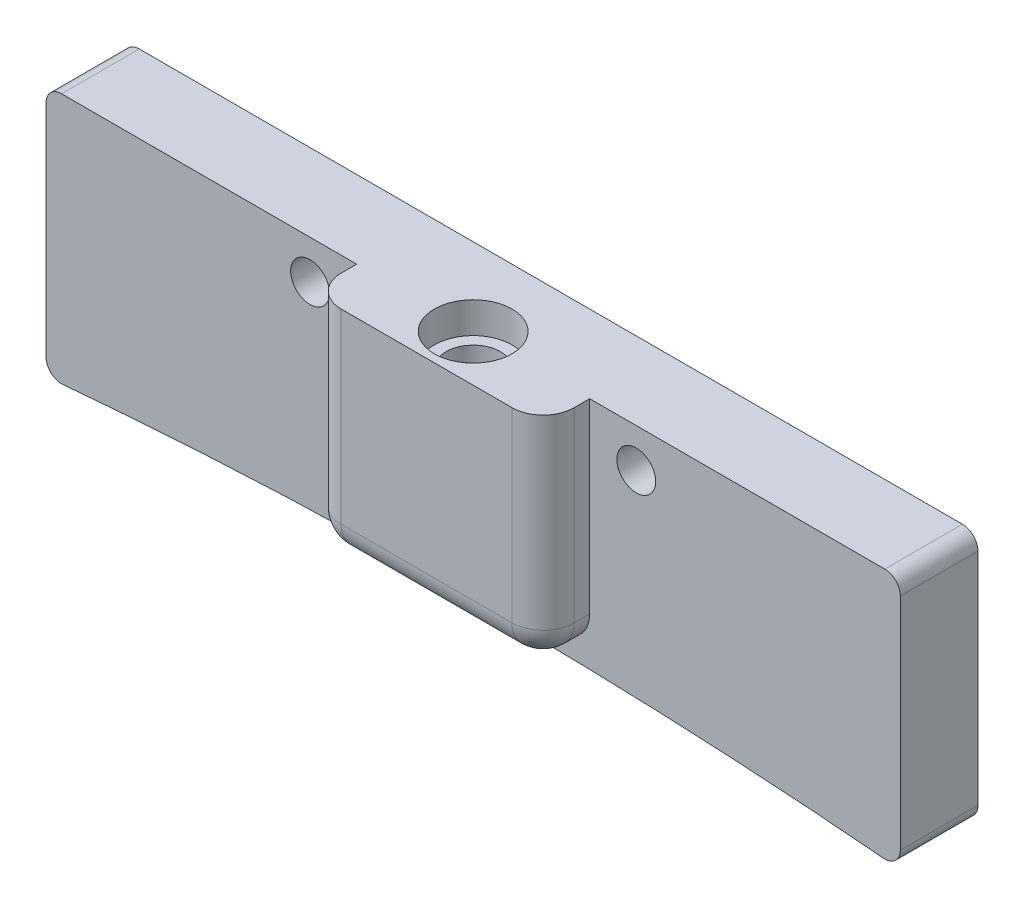
ISO-10303-21;
HEADER;
FILE_DESCRIPTION(('STEP AP214'),'2;1');
FILE_NAME('part.step','',(''),(''),'','','');
FILE_SCHEMA(('AUTOMOTIVE_DESIGN { 1 0 10303 214 1 1 1 1 }'));
ENDSEC;
DATA;
#1=APPLICATION_CONTEXT('core data for automotive mechanical design processes');
#2=APPLICATION_PROTOCOL_DEFINITION('international standard','automotive_design',2000,#1);
#3=PRODUCT_CONTEXT('',#1,'mechanical');
#4=PRODUCT('Part','Part','',(#3));
#5=PRODUCT_RELATED_PRODUCT_CATEGORY('part','',(#4));
#6=PRODUCT_DEFINITION_FORMATION('','',#4);
#7=PRODUCT_DEFINITION_CONTEXT('part definition',#1,'design');
#8=PRODUCT_DEFINITION('design','',#6,#7);
#9=PRODUCT_DEFINITION_SHAPE('','',#8);
#10=(LENGTH_UNIT() NAMED_UNIT(*) SI_UNIT(.MILLI.,.METRE.));
#11=(NAMED_UNIT(*) PLANE_ANGLE_UNIT() SI_UNIT($,.RADIAN.));
#12=(NAMED_UNIT(*) SI_UNIT($,.STERADIAN.) SOLID_ANGLE_UNIT());
#13=UNCERTAINTY_MEASURE_WITH_UNIT(LENGTH_MEASURE(1.E-05),#10,'distance_accuracy_value','');
#14=(GEOMETRIC_REPRESENTATION_CONTEXT(3) GLOBAL_UNCERTAINTY_ASSIGNED_CONTEXT((#13)) GLOBAL_UNIT_ASSIGNED_CONTEXT((#10,
#11,#12)) REPRESENTATION_CONTEXT('',''));
#15=CARTESIAN_POINT('',(0.,0.,0.));
#16=DIRECTION('',(0.,0.,1.));
#17=DIRECTION('',(1.,0.,0.));
#18=AXIS2_PLACEMENT_3D('',#15,#16,#17);
#19=CARTESIAN_POINT('',(-1.09287578986539E-12,-315.000000000012,5.));
#20=DIRECTION('',(0.,0.,-1.));
#21=DIRECTION('',(-1.,0.,0.));
#22=AXIS2_PLACEMENT_3D('',#19,#20,#21);
#23=CYLINDRICAL_SURFACE('',#22,299.999999999988);
#24=CARTESIAN_POINT('',(-1.09287578986539E-12,-315.000000000012,0.));
#25=DIRECTION('',(0.,0.,1.));
#26=DIRECTION('',(1.,0.,0.));
#27=AXIS2_PLACEMENT_3D('',#24,#25,#26);
#28=CIRCLE('',#27,299.999999999988);
#29=CARTESIAN_POINT('',(26.4119601328904,-16.1649144395453,0.));
#30=VERTEX_POINT('',#29);
#31=CARTESIAN_POINT('',(-26.4119602064126,-16.1649144460432,0.));
#32=VERTEX_POINT('',#31);
#33=EDGE_CURVE('E241',#30,#32,#28,.T.);
#34=ORIENTED_EDGE('',*,*,#33,.F.);
#35=DIRECTION('',(0.,0.,-1.));
#36=VECTOR('',#35,1.);
#37=CARTESIAN_POINT('',(26.4119601328904,-16.1649144395453,5.));
#38=LINE('',#37,#36);
#39=CARTESIAN_POINT('',(26.4119601328904,-16.1649144395453,5.));
#40=VERTEX_POINT('',#39);
#41=EDGE_CURVE('E215',#30,#40,#38,.F.);
#42=ORIENTED_EDGE('',*,*,#41,.T.);
#43=CARTESIAN_POINT('',(-1.09287578986539E-12,-315.000000000012,5.));
#44=DIRECTION('',(0.,0.,1.));
#45=DIRECTION('',(1.,0.,0.));
#46=AXIS2_PLACEMENT_3D('',#43,#44,#45);
#47=CIRCLE('',#46,299.999999999988);
#48=CARTESIAN_POINT('',(-26.4119602064126,-16.1649144460432,5.));
#49=VERTEX_POINT('',#48);
#50=EDGE_CURVE('E180',#40,#49,#47,.T.);
#51=ORIENTED_EDGE('',*,*,#50,.T.);
#52=DIRECTION('',(0.,0.,-1.));
#53=VECTOR('',#52,1.);
#54=CARTESIAN_POINT('',(-26.4119602064126,-16.1649144460432,5.));
#55=LINE('',#54,#53);
#56=EDGE_CURVE('E212',#49,#32,#55,.T.);
#57=ORIENTED_EDGE('',*,*,#56,.T.);
#58=EDGE_LOOP('',(#34,#42,#51,#57));
#59=FACE_BOUND('',#58,.T.);
#60=ADVANCED_FACE('F35',(#59),#23,.F.);
#61=CARTESIAN_POINT('',(27.5,0.,5.));
#62=DIRECTION('',(1.,0.,0.));
#63=DIRECTION('',(0.,0.,-1.));
#64=AXIS2_PLACEMENT_3D('',#61,#62,#63);
#65=PLANE('',#64);
#66=DIRECTION('',(0.,-1.,0.));
#67=VECTOR('',#66,1.);
#68=CARTESIAN_POINT('',(27.5,0.,5.));
#69=LINE('',#68,#67);
#70=CARTESIAN_POINT('',(27.5,-1.,5.));
#71=VERTEX_POINT('',#70);
#72=CARTESIAN_POINT('',(27.5,-15.168797487677,5.));
#73=VERTEX_POINT('',#72);
#74=EDGE_CURVE('E201',#71,#73,#69,.T.);
#75=ORIENTED_EDGE('',*,*,#74,.T.);
#76=DIRECTION('',(0.,0.,-1.));
#77=VECTOR('',#76,1.);
#78=CARTESIAN_POINT('',(27.5,-15.168797487677,5.));
#79=LINE('',#78,#77);
#80=CARTESIAN_POINT('',(27.5,-15.168797487677,0.));
#81=VERTEX_POINT('',#80);
#82=EDGE_CURVE('E200',#73,#81,#79,.T.);
#83=ORIENTED_EDGE('',*,*,#82,.T.);
#84=DIRECTION('',(0.,-1.,0.));
#85=VECTOR('',#84,1.);
#86=CARTESIAN_POINT('',(27.5,0.,0.));
#87=LINE('',#86,#85);
#88=CARTESIAN_POINT('',(27.5,-1.,0.));
#89=VERTEX_POINT('',#88);
#90=EDGE_CURVE('E232',#89,#81,#87,.T.);
#91=ORIENTED_EDGE('',*,*,#90,.F.);
#92=DIRECTION('',(0.,0.,-1.));
#93=VECTOR('',#92,1.);
#94=CARTESIAN_POINT('',(27.5,-1.,5.));
#95=LINE('',#94,#93);
#96=EDGE_CURVE('E198',#89,#71,#95,.F.);
#97=ORIENTED_EDGE('',*,*,#96,.T.);
#98=EDGE_LOOP('',(#75,#83,#91,#97));
#99=FACE_BOUND('',#98,.T.);
#100=ADVANCED_FACE('F389',(#99),#65,.T.);
#101=CARTESIAN_POINT('',(-27.5000000737673,0.,5.));
#102=DIRECTION('',(0.,1.,0.));
#103=DIRECTION('',(-1.,0.,0.));
#104=AXIS2_PLACEMENT_3D('',#101,#102,#103);
#105=PLANE('',#104);
#106=CARTESIAN_POINT('',(0.,0.,5.));
#107=DIRECTION('',(0.,1.,0.));
#108=DIRECTION('',(0.,0.,1.));
#109=AXIS2_PLACEMENT_3D('',#106,#107,#108);
#110=CIRCLE('',#109,2.5);
#111=CARTESIAN_POINT('',(0.,0.,7.5));
#112=VERTEX_POINT('',#111);
#113=EDGE_CURVE('E277',#112,#112,#110,.T.);
#114=ORIENTED_EDGE('',*,*,#113,.F.);
#115=EDGE_LOOP('',(#114));
#116=FACE_BOUND('',#115,.T.);
#117=DIRECTION('',(-1.,0.,0.));
#118=VECTOR('',#117,1.);
#119=CARTESIAN_POINT('',(-7.5,0.,8.));
#120=LINE('',#119,#118);
#121=CARTESIAN_POINT('',(5.5,0.,8.));
#122=VERTEX_POINT('',#121);
#123=CARTESIAN_POINT('',(-5.5,0.,8.));
#124=VERTEX_POINT('',#123);
#125=EDGE_CURVE('E171',#122,#124,#120,.T.);
#126=ORIENTED_EDGE('',*,*,#125,.F.);
#127=CARTESIAN_POINT('',(5.5,0.,6.));
#128=DIRECTION('',(0.,1.,0.));
#129=DIRECTION('',(-1.,0.,0.));
#130=AXIS2_PLACEMENT_3D('',#127,#128,#129);
#131=CIRCLE('',#130,2.);
#132=CARTESIAN_POINT('',(7.5,0.,6.));
#133=VERTEX_POINT('',#132);
#134=EDGE_CURVE('E253',#122,#133,#131,.T.);
#135=ORIENTED_EDGE('',*,*,#134,.T.);
#136=DIRECTION('',(0.,0.,-1.));
#137=VECTOR('',#136,1.);
#138=CARTESIAN_POINT('',(7.5,0.,8.));
#139=LINE('',#138,#137);
#140=CARTESIAN_POINT('',(7.5,0.,5.));
#141=VERTEX_POINT('',#140);
#142=EDGE_CURVE('E174',#133,#141,#139,.T.);
#143=ORIENTED_EDGE('',*,*,#142,.T.);
#144=DIRECTION('',(1.,0.,0.));
#145=VECTOR('',#144,1.);
#146=CARTESIAN_POINT('',(-27.5000000737673,0.,5.));
#147=LINE('',#146,#145);
#148=CARTESIAN_POINT('',(26.5,0.,5.));
#149=VERTEX_POINT('',#148);
#150=EDGE_CURVE('E222',#141,#149,#147,.T.);
#151=ORIENTED_EDGE('',*,*,#150,.T.);
#152=DIRECTION('',(0.,0.,-1.));
#153=VECTOR('',#152,1.);
#154=CARTESIAN_POINT('',(26.5,0.,5.));
#155=LINE('',#154,#153);
#156=CARTESIAN_POINT('',(26.5,0.,0.));
#157=VERTEX_POINT('',#156);
#158=EDGE_CURVE('E186',#149,#157,#155,.T.);
#159=ORIENTED_EDGE('',*,*,#158,.T.);
#160=DIRECTION('',(1.,0.,0.));
#161=VECTOR('',#160,1.);
#162=CARTESIAN_POINT('',(-27.5000000737673,0.,0.));
#163=LINE('',#162,#161);
#164=CARTESIAN_POINT('',(-26.5000000737673,0.,0.));
#165=VERTEX_POINT('',#164);
#166=EDGE_CURVE('E236',#165,#157,#163,.T.);
#167=ORIENTED_EDGE('',*,*,#166,.F.);
#168=DIRECTION('',(0.,0.,-1.));
#169=VECTOR('',#168,1.);
#170=CARTESIAN_POINT('',(-26.5000000737673,0.,5.));
#171=LINE('',#170,#169);
#172=CARTESIAN_POINT('',(-26.5000000737673,0.,5.));
#173=VERTEX_POINT('',#172);
#174=EDGE_CURVE('E329',#165,#173,#171,.F.);
#175=ORIENTED_EDGE('',*,*,#174,.T.);
#176=CARTESIAN_POINT('',(-7.5,0.,5.));
#177=VERTEX_POINT('',#176);
#178=EDGE_CURVE('E218',#173,#177,#147,.T.);
#179=ORIENTED_EDGE('',*,*,#178,.T.);
#180=DIRECTION('',(0.,0.,-1.));
#181=VECTOR('',#180,1.);
#182=CARTESIAN_POINT('',(-7.5,0.,8.));
#183=LINE('',#182,#181);
#184=CARTESIAN_POINT('',(-7.5,0.,6.));
#185=VERTEX_POINT('',#184);
#186=EDGE_CURVE('E190',#185,#177,#183,.T.);
#187=ORIENTED_EDGE('',*,*,#186,.F.);
#188=CARTESIAN_POINT('',(-5.5,0.,6.));
#189=DIRECTION('',(0.,1.,0.));
#190=DIRECTION('',(-1.,0.,0.));
#191=AXIS2_PLACEMENT_3D('',#188,#189,#190);
#192=CIRCLE('',#191,2.);
#193=EDGE_CURVE('E251',#185,#124,#192,.T.);
#194=ORIENTED_EDGE('',*,*,#193,.T.);
#195=EDGE_LOOP('',(#126,#135,#143,#151,#159,#167,#175,#179,#187,#194));
#196=FACE_BOUND('',#195,.T.);
#197=ADVANCED_FACE('F361',(#116,#196),#105,.T.);
#198=CARTESIAN_POINT('',(-27.5000000737673,-16.2630756067663,5.));
#199=DIRECTION('',(-1.,0.,0.));
#200=DIRECTION('',(0.,0.,1.));
#201=AXIS2_PLACEMENT_3D('',#198,#199,#200);
#202=PLANE('',#201);
#203=DIRECTION('',(0.,1.,0.));
#204=VECTOR('',#203,1.);
#205=CARTESIAN_POINT('',(-27.5000000737673,-16.2630756067663,0.));
#206=LINE('',#205,#204);
#207=CARTESIAN_POINT('',(-27.5000000737673,-15.1687974941966,0.));
#208=VERTEX_POINT('',#207);
#209=CARTESIAN_POINT('',(-27.5000000737673,-0.999999999999994,0.));
#210=VERTEX_POINT('',#209);
#211=EDGE_CURVE('E239',#208,#210,#206,.T.);
#212=ORIENTED_EDGE('',*,*,#211,.F.);
#213=DIRECTION('',(0.,0.,-1.));
#214=VECTOR('',#213,1.);
#215=CARTESIAN_POINT('',(-27.5000000737673,-15.1687974941966,5.));
#216=LINE('',#215,#214);
#217=CARTESIAN_POINT('',(-27.5000000737673,-15.1687974941966,5.));
#218=VERTEX_POINT('',#217);
#219=EDGE_CURVE('E324',#208,#218,#216,.F.);
#220=ORIENTED_EDGE('',*,*,#219,.T.);
#221=DIRECTION('',(0.,1.,0.));
#222=VECTOR('',#221,1.);
#223=CARTESIAN_POINT('',(-27.5000000737673,-16.2630756067663,5.));
#224=LINE('',#223,#222);
#225=CARTESIAN_POINT('',(-27.5000000737673,-0.999999999999994,5.));
#226=VERTEX_POINT('',#225);
#227=EDGE_CURVE('E226',#218,#226,#224,.T.);
#228=ORIENTED_EDGE('',*,*,#227,.T.);
#229=DIRECTION('',(0.,0.,-1.));
#230=VECTOR('',#229,1.);
#231=CARTESIAN_POINT('',(-27.5000000737673,-0.999999999999994,5.));
#232=LINE('',#231,#230);
#233=EDGE_CURVE('E321',#226,#210,#232,.T.);
#234=ORIENTED_EDGE('',*,*,#233,.T.);
#235=EDGE_LOOP('',(#212,#220,#228,#234));
#236=FACE_BOUND('',#235,.T.);
#237=ADVANCED_FACE('F303',(#236),#202,.T.);
#238=CARTESIAN_POINT('',(-1.09287578986539E-12,-315.000000000012,5.));
#239=DIRECTION('',(0.,0.,1.));
#240=DIRECTION('',(1.,0.,0.));
#241=AXIS2_PLACEMENT_3D('',#238,#239,#240);
#242=PLANE('',#241);
#243=CARTESIAN_POINT('',(-10.5,-2.5,5.));
#244=DIRECTION('',(0.,0.,1.));
#245=DIRECTION('',(1.,0.,0.));
#246=AXIS2_PLACEMENT_3D('',#243,#244,#245);
#247=CIRCLE('',#246,1.25);
#248=CARTESIAN_POINT('',(-9.25,-2.5,5.));
#249=VERTEX_POINT('',#248);
#250=EDGE_CURVE('E293',#249,#249,#247,.T.);
#251=ORIENTED_EDGE('',*,*,#250,.F.);
#252=EDGE_LOOP('',(#251));
#253=FACE_BOUND('',#252,.T.);
#254=CARTESIAN_POINT('',(10.5,-2.5,5.));
#255=DIRECTION('',(0.,0.,1.));
#256=DIRECTION('',(1.,0.,0.));
#257=AXIS2_PLACEMENT_3D('',#254,#255,#256);
#258=CIRCLE('',#257,1.25);
#259=CARTESIAN_POINT('',(11.75,-2.5,5.));
#260=VERTEX_POINT('',#259);
#261=EDGE_CURVE('E287',#260,#260,#258,.T.);
#262=ORIENTED_EDGE('',*,*,#261,.F.);
#263=EDGE_LOOP('',(#262));
#264=FACE_BOUND('',#263,.T.);
#265=ORIENTED_EDGE('',*,*,#50,.F.);
#266=CARTESIAN_POINT('',(26.5,-15.168797487677,5.));
#267=DIRECTION('',(0.,0.,1.));
#268=DIRECTION('',(1.,0.,0.));
#269=AXIS2_PLACEMENT_3D('',#266,#267,#268);
#270=CIRCLE('',#269,1.);
#271=EDGE_CURVE('E310',#40,#73,#270,.T.);
#272=ORIENTED_EDGE('',*,*,#271,.T.);
#273=ORIENTED_EDGE('',*,*,#74,.F.);
#274=CARTESIAN_POINT('',(26.5,-1.,5.));
#275=DIRECTION('',(0.,0.,1.));
#276=DIRECTION('',(1.,0.,0.));
#277=AXIS2_PLACEMENT_3D('',#274,#275,#276);
#278=CIRCLE('',#277,1.);
#279=EDGE_CURVE('E326',#71,#149,#278,.T.);
#280=ORIENTED_EDGE('',*,*,#279,.T.);
#281=ORIENTED_EDGE('',*,*,#150,.F.);
#282=DIRECTION('',(0.,1.,0.));
#283=VECTOR('',#282,1.);
#284=CARTESIAN_POINT('',(7.5,0.,5.));
#285=LINE('',#284,#283);
#286=CARTESIAN_POINT('',(7.5,-12.,5.));
#287=VERTEX_POINT('',#286);
#288=EDGE_CURVE('E175',#287,#141,#285,.T.);
#289=ORIENTED_EDGE('',*,*,#288,.F.);
#290=CARTESIAN_POINT('',(5.5,-12.,5.));
#291=DIRECTION('',(0.,0.,1.));
#292=DIRECTION('',(1.,0.,0.));
#293=AXIS2_PLACEMENT_3D('',#290,#291,#292);
#294=CIRCLE('',#293,2.);
#295=CARTESIAN_POINT('',(5.5,-14.,5.));
#296=VERTEX_POINT('',#295);
#297=EDGE_CURVE('E44',#287,#296,#294,.F.);
#298=ORIENTED_EDGE('',*,*,#297,.T.);
#299=DIRECTION('',(1.,0.,0.));
#300=VECTOR('',#299,1.);
#301=CARTESIAN_POINT('',(7.5,-14.,5.));
#302=LINE('',#301,#300);
#303=CARTESIAN_POINT('',(-5.5,-14.,5.));
#304=VERTEX_POINT('',#303);
#305=EDGE_CURVE('E164',#304,#296,#302,.T.);
#306=ORIENTED_EDGE('',*,*,#305,.F.);
#307=CARTESIAN_POINT('',(-5.5,-12.,5.));
#308=DIRECTION('',(0.,0.,1.));
#309=DIRECTION('',(1.,0.,0.));
#310=AXIS2_PLACEMENT_3D('',#307,#308,#309);
#311=CIRCLE('',#310,2.);
#312=CARTESIAN_POINT('',(-7.5,-12.,5.));
#313=VERTEX_POINT('',#312);
#314=EDGE_CURVE('E11',#304,#313,#311,.F.);
#315=ORIENTED_EDGE('',*,*,#314,.T.);
#316=DIRECTION('',(0.,-1.,0.));
#317=VECTOR('',#316,1.);
#318=CARTESIAN_POINT('',(-7.5,-14.,5.));
#319=LINE('',#318,#317);
#320=EDGE_CURVE('E161',#177,#313,#319,.T.);
#321=ORIENTED_EDGE('',*,*,#320,.F.);
#322=ORIENTED_EDGE('',*,*,#178,.F.);
#323=CARTESIAN_POINT('',(-26.5000000737673,-0.999999999999994,5.));
#324=DIRECTION('',(0.,0.,1.));
#325=DIRECTION('',(1.,0.,0.));
#326=AXIS2_PLACEMENT_3D('',#323,#324,#325);
#327=CIRCLE('',#326,1.);
#328=EDGE_CURVE('E217',#173,#226,#327,.T.);
#329=ORIENTED_EDGE('',*,*,#328,.T.);
#330=ORIENTED_EDGE('',*,*,#227,.F.);
#331=CARTESIAN_POINT('',(-26.5000000737673,-15.1687974941966,5.));
#332=DIRECTION('',(0.,0.,1.));
#333=DIRECTION('',(1.,0.,0.));
#334=AXIS2_PLACEMENT_3D('',#331,#332,#333);
#335=CIRCLE('',#334,1.);
#336=EDGE_CURVE('E314',#218,#49,#335,.T.);
#337=ORIENTED_EDGE('',*,*,#336,.T.);
#338=EDGE_LOOP('',(#265,#272,#273,#280,#281,#289,#298,#306,#315,#321,#322,#329,#330,#337));
#339=FACE_BOUND('',#338,.T.);
#340=ADVANCED_FACE('F299',(#253,#264,#339),#242,.T.);
#341=CARTESIAN_POINT('',(-1.09287578986539E-12,-315.000000000012,0.));
#342=DIRECTION('',(0.,0.,1.));
#343=DIRECTION('',(1.,0.,0.));
#344=AXIS2_PLACEMENT_3D('',#341,#342,#343);
#345=PLANE('',#344);
#346=CARTESIAN_POINT('',(-10.5,-2.5,0.));
#347=DIRECTION('',(0.,0.,1.));
#348=DIRECTION('',(1.,0.,0.));
#349=AXIS2_PLACEMENT_3D('',#346,#347,#348);
#350=CIRCLE('',#349,1.25);
#351=CARTESIAN_POINT('',(-9.25,-2.5,0.));
#352=VERTEX_POINT('',#351);
#353=EDGE_CURVE('E290',#352,#352,#350,.T.);
#354=ORIENTED_EDGE('',*,*,#353,.T.);
#355=EDGE_LOOP('',(#354));
#356=FACE_BOUND('',#355,.T.);
#357=CARTESIAN_POINT('',(10.5,-2.5,0.));
#358=DIRECTION('',(0.,0.,1.));
#359=DIRECTION('',(1.,0.,0.));
#360=AXIS2_PLACEMENT_3D('',#357,#358,#359);
#361=CIRCLE('',#360,1.25);
#362=CARTESIAN_POINT('',(11.75,-2.5,0.));
#363=VERTEX_POINT('',#362);
#364=EDGE_CURVE('E263',#363,#363,#361,.T.);
#365=ORIENTED_EDGE('',*,*,#364,.T.);
#366=EDGE_LOOP('',(#365));
#367=FACE_BOUND('',#366,.T.);
#368=ORIENTED_EDGE('',*,*,#90,.T.);
#369=CARTESIAN_POINT('',(26.5,-15.168797487677,0.));
#370=DIRECTION('',(0.,0.,1.));
#371=DIRECTION('',(1.,0.,0.));
#372=AXIS2_PLACEMENT_3D('',#369,#370,#371);
#373=CIRCLE('',#372,1.);
#374=EDGE_CURVE('E210',#81,#30,#373,.F.);
#375=ORIENTED_EDGE('',*,*,#374,.T.);
#376=ORIENTED_EDGE('',*,*,#33,.T.);
#377=CARTESIAN_POINT('',(-26.5000000737673,-15.1687974941966,0.));
#378=DIRECTION('',(0.,0.,1.));
#379=DIRECTION('',(1.,0.,0.));
#380=AXIS2_PLACEMENT_3D('',#377,#378,#379);
#381=CIRCLE('',#380,1.);
#382=EDGE_CURVE('E208',#32,#208,#381,.F.);
#383=ORIENTED_EDGE('',*,*,#382,.T.);
#384=ORIENTED_EDGE('',*,*,#211,.T.);
#385=CARTESIAN_POINT('',(-26.5000000737673,-0.999999999999994,0.));
#386=DIRECTION('',(0.,0.,1.));
#387=DIRECTION('',(1.,0.,0.));
#388=AXIS2_PLACEMENT_3D('',#385,#386,#387);
#389=CIRCLE('',#388,1.);
#390=EDGE_CURVE('E204',#210,#165,#389,.F.);
#391=ORIENTED_EDGE('',*,*,#390,.T.);
#392=ORIENTED_EDGE('',*,*,#166,.T.);
#393=CARTESIAN_POINT('',(26.5,-1.,0.));
#394=DIRECTION('',(0.,0.,1.));
#395=DIRECTION('',(1.,0.,0.));
#396=AXIS2_PLACEMENT_3D('',#393,#394,#395);
#397=CIRCLE('',#396,1.);
#398=EDGE_CURVE('E206',#157,#89,#397,.F.);
#399=ORIENTED_EDGE('',*,*,#398,.T.);
#400=EDGE_LOOP('',(#368,#375,#376,#383,#384,#391,#392,#399));
#401=FACE_BOUND('',#400,.T.);
#402=ADVANCED_FACE('F302',(#356,#367,#401),#345,.F.);
#403=CARTESIAN_POINT('',(-7.5,-14.,8.));
#404=DIRECTION('',(1.,0.,0.));
#405=DIRECTION('',(0.,1.,0.));
#406=AXIS2_PLACEMENT_3D('',#403,#404,#405);
#407=PLANE('',#406);
#408=ORIENTED_EDGE('',*,*,#320,.T.);
#409=DIRECTION('',(0.,0.,-1.));
#410=VECTOR('',#409,1.);
#411=CARTESIAN_POINT('',(-7.5,-12.,8.));
#412=LINE('',#411,#410);
#413=CARTESIAN_POINT('',(-7.5,-12.,6.));
#414=VERTEX_POINT('',#413);
#415=EDGE_CURVE('E52',#313,#414,#412,.F.);
#416=ORIENTED_EDGE('',*,*,#415,.T.);
#417=DIRECTION('',(0.,-1.,0.));
#418=VECTOR('',#417,1.);
#419=CARTESIAN_POINT('',(-7.5,-14.,6.));
#420=LINE('',#419,#418);
#421=EDGE_CURVE('E255',#414,#185,#420,.F.);
#422=ORIENTED_EDGE('',*,*,#421,.T.);
#423=ORIENTED_EDGE('',*,*,#186,.T.);
#424=EDGE_LOOP('',(#408,#416,#422,#423));
#425=FACE_BOUND('',#424,.T.);
#426=ADVANCED_FACE('F554',(#425),#407,.F.);
#427=CARTESIAN_POINT('',(7.5,-14.,8.));
#428=DIRECTION('',(0.,1.,0.));
#429=DIRECTION('',(0.,0.,1.));
#430=AXIS2_PLACEMENT_3D('',#427,#428,#429);
#431=PLANE('',#430);
#432=ORIENTED_EDGE('',*,*,#305,.T.);
#433=DIRECTION('',(0.,0.,-1.));
#434=VECTOR('',#433,1.);
#435=CARTESIAN_POINT('',(5.5,-14.,8.));
#436=LINE('',#435,#434);
#437=CARTESIAN_POINT('',(5.5,-14.,6.));
#438=VERTEX_POINT('',#437);
#439=EDGE_CURVE('E349',#296,#438,#436,.F.);
#440=ORIENTED_EDGE('',*,*,#439,.T.);
#441=DIRECTION('',(1.,0.,0.));
#442=VECTOR('',#441,1.);
#443=CARTESIAN_POINT('',(7.5,-14.,6.));
#444=LINE('',#443,#442);
#445=CARTESIAN_POINT('',(-5.5,-14.,6.));
#446=VERTEX_POINT('',#445);
#447=EDGE_CURVE('E342',#438,#446,#444,.F.);
#448=ORIENTED_EDGE('',*,*,#447,.T.);
#449=DIRECTION('',(0.,0.,-1.));
#450=VECTOR('',#449,1.);
#451=CARTESIAN_POINT('',(-5.5,-14.,8.));
#452=LINE('',#451,#450);
#453=EDGE_CURVE('E345',#446,#304,#452,.T.);
#454=ORIENTED_EDGE('',*,*,#453,.T.);
#455=EDGE_LOOP('',(#432,#440,#448,#454));
#456=FACE_BOUND('',#455,.T.);
#457=ADVANCED_FACE('F372',(#456),#431,.F.);
#458=CARTESIAN_POINT('',(7.5,0.,8.));
#459=DIRECTION('',(-1.,0.,0.));
#460=DIRECTION('',(0.,0.,1.));
#461=AXIS2_PLACEMENT_3D('',#458,#459,#460);
#462=PLANE('',#461);
#463=DIRECTION('',(0.,1.,0.));
#464=VECTOR('',#463,1.);
#465=CARTESIAN_POINT('',(7.5,0.,6.));
#466=LINE('',#465,#464);
#467=CARTESIAN_POINT('',(7.5,-12.,6.));
#468=VERTEX_POINT('',#467);
#469=EDGE_CURVE('E191',#133,#468,#466,.F.);
#470=ORIENTED_EDGE('',*,*,#469,.T.);
#471=DIRECTION('',(0.,0.,-1.));
#472=VECTOR('',#471,1.);
#473=CARTESIAN_POINT('',(7.5,-12.,8.));
#474=LINE('',#473,#472);
#475=EDGE_CURVE('E336',#468,#287,#474,.T.);
#476=ORIENTED_EDGE('',*,*,#475,.T.);
#477=ORIENTED_EDGE('',*,*,#288,.T.);
#478=ORIENTED_EDGE('',*,*,#142,.F.);
#479=EDGE_LOOP('',(#470,#476,#477,#478));
#480=FACE_BOUND('',#479,.T.);
#481=ADVANCED_FACE('F539',(#480),#462,.F.);
#482=CARTESIAN_POINT('',(0.,0.,8.));
#483=DIRECTION('',(0.,0.,-1.));
#484=DIRECTION('',(-1.,0.,0.));
#485=AXIS2_PLACEMENT_3D('',#482,#483,#484);
#486=PLANE('',#485);
#487=DIRECTION('',(1.,0.,0.));
#488=VECTOR('',#487,1.);
#489=CARTESIAN_POINT('',(0.,-12.,8.));
#490=LINE('',#489,#488);
#491=CARTESIAN_POINT('',(-5.5,-12.,8.));
#492=VERTEX_POINT('',#491);
#493=CARTESIAN_POINT('',(5.5,-12.,8.));
#494=VERTEX_POINT('',#493);
#495=EDGE_CURVE('E352',#492,#494,#490,.T.);
#496=ORIENTED_EDGE('',*,*,#495,.T.);
#497=DIRECTION('',(0.,1.,0.));
#498=VECTOR('',#497,1.);
#499=CARTESIAN_POINT('',(5.5,0.,8.));
#500=LINE('',#499,#498);
#501=EDGE_CURVE('E249',#494,#122,#500,.T.);
#502=ORIENTED_EDGE('',*,*,#501,.T.);
#503=ORIENTED_EDGE('',*,*,#125,.T.);
#504=DIRECTION('',(0.,-1.,0.));
#505=VECTOR('',#504,1.);
#506=CARTESIAN_POINT('',(-5.5,0.,8.));
#507=LINE('',#506,#505);
#508=EDGE_CURVE('E351',#124,#492,#507,.T.);
#509=ORIENTED_EDGE('',*,*,#508,.T.);
#510=EDGE_LOOP('',(#496,#502,#503,#509));
#511=FACE_BOUND('',#510,.T.);
#512=ADVANCED_FACE('F155',(#511),#486,.F.);
#513=CARTESIAN_POINT('',(0.,-10.,5.));
#514=DIRECTION('',(0.,1.,0.));
#515=DIRECTION('',(0.,0.,1.));
#516=AXIS2_PLACEMENT_3D('',#513,#514,#515);
#517=CONICAL_SURFACE('',#516,1.75,0.785398163397447);
#518=CARTESIAN_POINT('',(0.,-11.75,5.));
#519=VERTEX_POINT('',#518);
#520=VERTEX_LOOP('',#519);
#521=FACE_BOUND('',#520,.T.);
#522=CARTESIAN_POINT('',(0.,-10.,5.));
#523=DIRECTION('',(0.,1.,0.));
#524=DIRECTION('',(0.,0.,1.));
#525=AXIS2_PLACEMENT_3D('',#522,#523,#524);
#526=CIRCLE('',#525,1.75);
#527=CARTESIAN_POINT('',(0.,-10.,6.75));
#528=VERTEX_POINT('',#527);
#529=EDGE_CURVE('E159',#528,#528,#526,.T.);
#530=ORIENTED_EDGE('',*,*,#529,.T.);
#531=EDGE_LOOP('',(#530));
#532=FACE_BOUND('',#531,.T.);
#533=ADVANCED_FACE('F151',(#521,#532),#517,.F.);
#534=CARTESIAN_POINT('',(0.,0.,5.));
#535=DIRECTION('',(0.,1.,0.));
#536=DIRECTION('',(0.,0.,1.));
#537=AXIS2_PLACEMENT_3D('',#534,#535,#536);
#538=CYLINDRICAL_SURFACE('',#537,1.75);
#539=ORIENTED_EDGE('',*,*,#529,.F.);
#540=EDGE_LOOP('',(#539));
#541=FACE_BOUND('',#540,.T.);
#542=CARTESIAN_POINT('',(0.,-2.,5.));
#543=DIRECTION('',(0.,1.,0.));
#544=DIRECTION('',(0.,0.,1.));
#545=AXIS2_PLACEMENT_3D('',#542,#543,#544);
#546=CIRCLE('',#545,1.75);
#547=CARTESIAN_POINT('',(0.,-2.,6.75));
#548=VERTEX_POINT('',#547);
#549=EDGE_CURVE('E162',#548,#548,#546,.T.);
#550=ORIENTED_EDGE('',*,*,#549,.T.);
#551=EDGE_LOOP('',(#550));
#552=FACE_BOUND('',#551,.T.);
#553=ADVANCED_FACE('F154',(#541,#552),#538,.F.);
#554=CARTESIAN_POINT('',(1.75,-2.,5.));
#555=DIRECTION('',(0.,-1.,0.));
#556=DIRECTION('',(0.,0.,-1.));
#557=AXIS2_PLACEMENT_3D('',#554,#555,#556);
#558=PLANE('',#557);
#559=ORIENTED_EDGE('',*,*,#549,.F.);
#560=EDGE_LOOP('',(#559));
#561=FACE_BOUND('',#560,.T.);
#562=CARTESIAN_POINT('',(0.,-2.,5.));
#563=DIRECTION('',(0.,1.,0.));
#564=DIRECTION('',(0.,0.,1.));
#565=AXIS2_PLACEMENT_3D('',#562,#563,#564);
#566=CIRCLE('',#565,2.5);
#567=CARTESIAN_POINT('',(0.,-2.,7.5));
#568=VERTEX_POINT('',#567);
#569=EDGE_CURVE('E167',#568,#568,#566,.T.);
#570=ORIENTED_EDGE('',*,*,#569,.T.);
#571=EDGE_LOOP('',(#570));
#572=FACE_BOUND('',#571,.T.);
#573=ADVANCED_FACE('F510',(#561,#572),#558,.F.);
#574=CARTESIAN_POINT('',(0.,0.,5.));
#575=DIRECTION('',(0.,1.,0.));
#576=DIRECTION('',(0.,0.,1.));
#577=AXIS2_PLACEMENT_3D('',#574,#575,#576);
#578=CYLINDRICAL_SURFACE('',#577,2.5);
#579=ORIENTED_EDGE('',*,*,#569,.F.);
#580=EDGE_LOOP('',(#579));
#581=FACE_BOUND('',#580,.T.);
#582=ORIENTED_EDGE('',*,*,#113,.T.);
#583=EDGE_LOOP('',(#582));
#584=FACE_BOUND('',#583,.T.);
#585=ADVANCED_FACE('F402',(#581,#584),#578,.F.);
#586=CARTESIAN_POINT('',(26.5,-15.168797487677,5.));
#587=DIRECTION('',(0.,0.,-1.));
#588=DIRECTION('',(-1.,0.,0.));
#589=AXIS2_PLACEMENT_3D('',#586,#587,#588);
#590=CYLINDRICAL_SURFACE('',#589,1.);
#591=ORIENTED_EDGE('',*,*,#271,.F.);
#592=ORIENTED_EDGE('',*,*,#41,.F.);
#593=ORIENTED_EDGE('',*,*,#374,.F.);
#594=ORIENTED_EDGE('',*,*,#82,.F.);
#595=EDGE_LOOP('',(#591,#592,#593,#594));
#596=FACE_BOUND('',#595,.T.);
#597=ADVANCED_FACE('F320',(#596),#590,.T.);
#598=CARTESIAN_POINT('',(-26.5000000737673,-15.1687974941966,5.));
#599=DIRECTION('',(0.,0.,-1.));
#600=DIRECTION('',(-1.,0.,0.));
#601=AXIS2_PLACEMENT_3D('',#598,#599,#600);
#602=CYLINDRICAL_SURFACE('',#601,1.);
#603=ORIENTED_EDGE('',*,*,#336,.F.);
#604=ORIENTED_EDGE('',*,*,#219,.F.);
#605=ORIENTED_EDGE('',*,*,#382,.F.);
#606=ORIENTED_EDGE('',*,*,#56,.F.);
#607=EDGE_LOOP('',(#603,#604,#605,#606));
#608=FACE_BOUND('',#607,.T.);
#609=ADVANCED_FACE('F401',(#608),#602,.T.);
#610=CARTESIAN_POINT('',(26.5,-1.,5.));
#611=DIRECTION('',(0.,0.,-1.));
#612=DIRECTION('',(-1.,0.,0.));
#613=AXIS2_PLACEMENT_3D('',#610,#611,#612);
#614=CYLINDRICAL_SURFACE('',#613,1.);
#615=ORIENTED_EDGE('',*,*,#279,.F.);
#616=ORIENTED_EDGE('',*,*,#96,.F.);
#617=ORIENTED_EDGE('',*,*,#398,.F.);
#618=ORIENTED_EDGE('',*,*,#158,.F.);
#619=EDGE_LOOP('',(#615,#616,#617,#618));
#620=FACE_BOUND('',#619,.T.);
#621=ADVANCED_FACE('F385',(#620),#614,.T.);
#622=CARTESIAN_POINT('',(-26.5000000737673,-0.999999999999994,5.));
#623=DIRECTION('',(0.,0.,-1.));
#624=DIRECTION('',(-1.,0.,0.));
#625=AXIS2_PLACEMENT_3D('',#622,#623,#624);
#626=CYLINDRICAL_SURFACE('',#625,1.);
#627=ORIENTED_EDGE('',*,*,#328,.F.);
#628=ORIENTED_EDGE('',*,*,#174,.F.);
#629=ORIENTED_EDGE('',*,*,#390,.F.);
#630=ORIENTED_EDGE('',*,*,#233,.F.);
#631=EDGE_LOOP('',(#627,#628,#629,#630));
#632=FACE_BOUND('',#631,.T.);
#633=ADVANCED_FACE('F378',(#632),#626,.T.);
#634=CARTESIAN_POINT('',(-5.5,-12.,8.));
#635=DIRECTION('',(0.,0.,-1.));
#636=DIRECTION('',(-1.,0.,0.));
#637=AXIS2_PLACEMENT_3D('',#634,#635,#636);
#638=CYLINDRICAL_SURFACE('',#637,2.);
#639=ORIENTED_EDGE('',*,*,#314,.F.);
#640=ORIENTED_EDGE('',*,*,#453,.F.);
#641=CARTESIAN_POINT('',(-5.5,-12.,6.));
#642=DIRECTION('',(0.,0.,1.));
#643=DIRECTION('',(1.,0.,0.));
#644=AXIS2_PLACEMENT_3D('',#641,#642,#643);
#645=CIRCLE('',#644,2.);
#646=EDGE_CURVE('E39',#414,#446,#645,.T.);
#647=ORIENTED_EDGE('',*,*,#646,.F.);
#648=ORIENTED_EDGE('',*,*,#415,.F.);
#649=EDGE_LOOP('',(#639,#640,#647,#648));
#650=FACE_BOUND('',#649,.T.);
#651=ADVANCED_FACE('F37',(#650),#638,.T.);
#652=CARTESIAN_POINT('',(-5.5,0.,6.));
#653=DIRECTION('',(0.,-1.,0.));
#654=DIRECTION('',(1.,0.,0.));
#655=AXIS2_PLACEMENT_3D('',#652,#653,#654);
#656=CYLINDRICAL_SURFACE('',#655,2.);
#657=ORIENTED_EDGE('',*,*,#193,.F.);
#658=ORIENTED_EDGE('',*,*,#421,.F.);
#659=CARTESIAN_POINT('',(-5.5,-12.,6.));
#660=DIRECTION('',(0.,-1.,0.));
#661=DIRECTION('',(0.,0.,-1.));
#662=AXIS2_PLACEMENT_3D('',#659,#660,#661);
#663=CIRCLE('',#662,2.);
#664=EDGE_CURVE('E271',#492,#414,#663,.T.);
#665=ORIENTED_EDGE('',*,*,#664,.F.);
#666=ORIENTED_EDGE('',*,*,#508,.F.);
#667=EDGE_LOOP('',(#657,#658,#665,#666));
#668=FACE_BOUND('',#667,.T.);
#669=ADVANCED_FACE('F377',(#668),#656,.T.);
#670=CARTESIAN_POINT('',(-5.5,-12.,6.));
#671=DIRECTION('',(0.,0.,1.));
#672=DIRECTION('',(1.,0.,0.));
#673=AXIS2_PLACEMENT_3D('',#670,#671,#672);
#674=SPHERICAL_SURFACE('',#673,2.);
#675=ORIENTED_EDGE('',*,*,#664,.T.);
#676=ORIENTED_EDGE('',*,*,#646,.T.);
#677=CARTESIAN_POINT('',(-5.5,-12.,6.));
#678=DIRECTION('',(-1.,0.,0.));
#679=DIRECTION('',(0.,0.,1.));
#680=AXIS2_PLACEMENT_3D('',#677,#678,#679);
#681=CIRCLE('',#680,2.);
#682=EDGE_CURVE('E269',#492,#446,#681,.F.);
#683=ORIENTED_EDGE('',*,*,#682,.F.);
#684=EDGE_LOOP('',(#675,#676,#683));
#685=FACE_BOUND('',#684,.T.);
#686=ADVANCED_FACE('F383',(#685),#674,.T.);
#687=CARTESIAN_POINT('',(0.,-12.,6.));
#688=DIRECTION('',(1.,0.,0.));
#689=DIRECTION('',(0.,0.,-1.));
#690=AXIS2_PLACEMENT_3D('',#687,#688,#689);
#691=CYLINDRICAL_SURFACE('',#690,2.);
#692=ORIENTED_EDGE('',*,*,#682,.T.);
#693=ORIENTED_EDGE('',*,*,#447,.F.);
#694=CARTESIAN_POINT('',(5.5,-12.,6.));
#695=DIRECTION('',(1.,0.,0.));
#696=DIRECTION('',(0.,0.,-1.));
#697=AXIS2_PLACEMENT_3D('',#694,#695,#696);
#698=CIRCLE('',#697,2.);
#699=EDGE_CURVE('E266',#494,#438,#698,.T.);
#700=ORIENTED_EDGE('',*,*,#699,.F.);
#701=ORIENTED_EDGE('',*,*,#495,.F.);
#702=EDGE_LOOP('',(#692,#693,#700,#701));
#703=FACE_BOUND('',#702,.T.);
#704=ADVANCED_FACE('F416',(#703),#691,.T.);
#705=CARTESIAN_POINT('',(5.5,0.,6.));
#706=DIRECTION('',(0.,1.,0.));
#707=DIRECTION('',(0.,0.,1.));
#708=AXIS2_PLACEMENT_3D('',#705,#706,#707);
#709=CYLINDRICAL_SURFACE('',#708,2.);
#710=ORIENTED_EDGE('',*,*,#134,.F.);
#711=ORIENTED_EDGE('',*,*,#501,.F.);
#712=CARTESIAN_POINT('',(5.5,-12.,6.));
#713=DIRECTION('',(0.,-1.,0.));
#714=DIRECTION('',(0.,0.,-1.));
#715=AXIS2_PLACEMENT_3D('',#712,#713,#714);
#716=CIRCLE('',#715,2.);
#717=EDGE_CURVE('E262',#468,#494,#716,.T.);
#718=ORIENTED_EDGE('',*,*,#717,.F.);
#719=ORIENTED_EDGE('',*,*,#469,.F.);
#720=EDGE_LOOP('',(#710,#711,#718,#719));
#721=FACE_BOUND('',#720,.T.);
#722=ADVANCED_FACE('F363',(#721),#709,.T.);
#723=CARTESIAN_POINT('',(5.5,-12.,6.));
#724=DIRECTION('',(0.,0.,1.));
#725=DIRECTION('',(1.,0.,0.));
#726=AXIS2_PLACEMENT_3D('',#723,#724,#725);
#727=SPHERICAL_SURFACE('',#726,2.);
#728=ORIENTED_EDGE('',*,*,#717,.T.);
#729=ORIENTED_EDGE('',*,*,#699,.T.);
#730=CARTESIAN_POINT('',(5.5,-12.,6.));
#731=DIRECTION('',(0.,0.,1.));
#732=DIRECTION('',(1.,0.,0.));
#733=AXIS2_PLACEMENT_3D('',#730,#731,#732);
#734=CIRCLE('',#733,2.);
#735=EDGE_CURVE('E259',#468,#438,#734,.F.);
#736=ORIENTED_EDGE('',*,*,#735,.F.);
#737=EDGE_LOOP('',(#728,#729,#736));
#738=FACE_BOUND('',#737,.T.);
#739=ADVANCED_FACE('F366',(#738),#727,.T.);
#740=CARTESIAN_POINT('',(5.5,-12.,8.));
#741=DIRECTION('',(0.,0.,-1.));
#742=DIRECTION('',(-1.,0.,0.));
#743=AXIS2_PLACEMENT_3D('',#740,#741,#742);
#744=CYLINDRICAL_SURFACE('',#743,2.);
#745=ORIENTED_EDGE('',*,*,#735,.T.);
#746=ORIENTED_EDGE('',*,*,#439,.F.);
#747=ORIENTED_EDGE('',*,*,#297,.F.);
#748=ORIENTED_EDGE('',*,*,#475,.F.);
#749=EDGE_LOOP('',(#745,#746,#747,#748));
#750=FACE_BOUND('',#749,.T.);
#751=ADVANCED_FACE('F369',(#750),#744,.T.);
#752=CARTESIAN_POINT('',(10.5,-2.5,5.));
#753=DIRECTION('',(0.,0.,1.));
#754=DIRECTION('',(1.,0.,0.));
#755=AXIS2_PLACEMENT_3D('',#752,#753,#754);
#756=CYLINDRICAL_SURFACE('',#755,1.25);
#757=ORIENTED_EDGE('',*,*,#364,.F.);
#758=EDGE_LOOP('',(#757));
#759=FACE_BOUND('',#758,.T.);
#760=ORIENTED_EDGE('',*,*,#261,.T.);
#761=EDGE_LOOP('',(#760));
#762=FACE_BOUND('',#761,.T.);
#763=ADVANCED_FACE('F411',(#759,#762),#756,.F.);
#764=CARTESIAN_POINT('',(-10.5,-2.5,5.));
#765=DIRECTION('',(0.,0.,1.));
#766=DIRECTION('',(1.,0.,0.));
#767=AXIS2_PLACEMENT_3D('',#764,#765,#766);
#768=CYLINDRICAL_SURFACE('',#767,1.25);
#769=ORIENTED_EDGE('',*,*,#353,.F.);
#770=EDGE_LOOP('',(#769));
#771=FACE_BOUND('',#770,.T.);
#772=ORIENTED_EDGE('',*,*,#250,.T.);
#773=EDGE_LOOP('',(#772));
#774=FACE_BOUND('',#773,.T.);
#775=ADVANCED_FACE('F297',(#771,#774),#768,.F.);
#776=CLOSED_SHELL('',(#60,#100,#197,#237,#340,#402,#426,#457,#481,#512,#533,#553,#573,#585,#597,
#609,#621,#633,#651,#669,#686,#704,#722,#739,#751,#763,#775));
#777=MANIFOLD_SOLID_BREP('B2',#776);
#778=ADVANCED_BREP_SHAPE_REPRESENTATION('',(#18,#777),#14);
#779=SHAPE_DEFINITION_REPRESENTATION(#9,#778);
ENDSEC;
END-ISO-10303-21;
